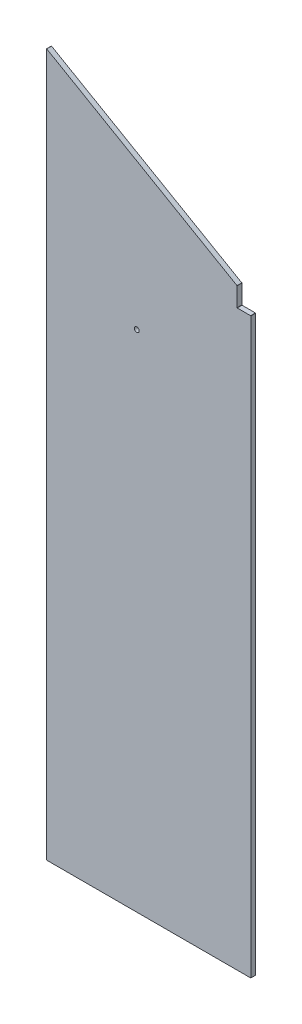
ISO-10303-21;
HEADER;
FILE_DESCRIPTION(('STEP AP214'),'2;1');
FILE_NAME('part.step','',(''),(''),'','','');
FILE_SCHEMA(('AUTOMOTIVE_DESIGN { 1 0 10303 214 1 1 1 1 }'));
ENDSEC;
DATA;
#1=APPLICATION_CONTEXT('core data for automotive mechanical design processes');
#2=APPLICATION_PROTOCOL_DEFINITION('international standard','automotive_design',2000,#1);
#3=PRODUCT_CONTEXT('',#1,'mechanical');
#4=PRODUCT('Part','Part','',(#3));
#5=PRODUCT_RELATED_PRODUCT_CATEGORY('part','',(#4));
#6=PRODUCT_DEFINITION_FORMATION('','',#4);
#7=PRODUCT_DEFINITION_CONTEXT('part definition',#1,'design');
#8=PRODUCT_DEFINITION('design','',#6,#7);
#9=PRODUCT_DEFINITION_SHAPE('','',#8);
#10=(LENGTH_UNIT() NAMED_UNIT(*) SI_UNIT(.MILLI.,.METRE.));
#11=(NAMED_UNIT(*) PLANE_ANGLE_UNIT() SI_UNIT($,.RADIAN.));
#12=(NAMED_UNIT(*) SI_UNIT($,.STERADIAN.) SOLID_ANGLE_UNIT());
#13=UNCERTAINTY_MEASURE_WITH_UNIT(LENGTH_MEASURE(1.E-05),#10,'distance_accuracy_value','');
#14=(GEOMETRIC_REPRESENTATION_CONTEXT(3) GLOBAL_UNCERTAINTY_ASSIGNED_CONTEXT((#13)) GLOBAL_UNIT_ASSIGNED_CONTEXT((#10,
#11,#12)) REPRESENTATION_CONTEXT('',''));
#15=CARTESIAN_POINT('',(0.,0.,0.));
#16=DIRECTION('',(0.,0.,1.));
#17=DIRECTION('',(1.,0.,0.));
#18=AXIS2_PLACEMENT_3D('',#15,#16,#17);
#19=CARTESIAN_POINT('',(270.002,0.,6.35));
#20=DIRECTION('',(0.,1.,0.));
#21=DIRECTION('',(-1.,0.,0.));
#22=AXIS2_PLACEMENT_3D('',#19,#20,#21);
#23=PLANE('',#22);
#24=DIRECTION('',(1.,0.,0.));
#25=VECTOR('',#24,1.);
#26=CARTESIAN_POINT('',(270.002,0.,6.35));
#27=LINE('',#26,#25);
#28=CARTESIAN_POINT('',(0.253999999999976,0.,6.35));
#29=VERTEX_POINT('',#28);
#30=CARTESIAN_POINT('',(270.002,0.,6.35));
#31=VERTEX_POINT('',#30);
#32=EDGE_CURVE('E129',#29,#31,#27,.T.);
#33=ORIENTED_EDGE('',*,*,#32,.F.);
#34=DIRECTION('',(0.,0.,-1.));
#35=VECTOR('',#34,1.);
#36=CARTESIAN_POINT('',(0.253999999999976,0.,6.35));
#37=LINE('',#36,#35);
#38=CARTESIAN_POINT('',(0.253999999999976,0.,0.));
#39=VERTEX_POINT('',#38);
#40=EDGE_CURVE('E218',#29,#39,#37,.T.);
#41=ORIENTED_EDGE('',*,*,#40,.T.);
#42=DIRECTION('',(1.,0.,0.));
#43=VECTOR('',#42,1.);
#44=CARTESIAN_POINT('',(270.002,0.,0.));
#45=LINE('',#44,#43);
#46=CARTESIAN_POINT('',(270.002,0.,0.));
#47=VERTEX_POINT('',#46);
#48=EDGE_CURVE('E155',#39,#47,#45,.T.);
#49=ORIENTED_EDGE('',*,*,#48,.T.);
#50=DIRECTION('',(0.,0.,-1.));
#51=VECTOR('',#50,1.);
#52=CARTESIAN_POINT('',(270.002,0.,6.35));
#53=LINE('',#52,#51);
#54=EDGE_CURVE('E148',#31,#47,#53,.T.);
#55=ORIENTED_EDGE('',*,*,#54,.F.);
#56=EDGE_LOOP('',(#33,#41,#49,#55));
#57=FACE_BOUND('',#56,.T.);
#58=ADVANCED_FACE('F45',(#57),#23,.F.);
#59=CARTESIAN_POINT('',(270.002,0.,6.35));
#60=DIRECTION('',(-1.,0.,0.));
#61=DIRECTION('',(0.,-1.,0.));
#62=AXIS2_PLACEMENT_3D('',#59,#60,#61);
#63=PLANE('',#62);
#64=DIRECTION('',(0.,1.,0.));
#65=VECTOR('',#64,1.);
#66=CARTESIAN_POINT('',(270.002,0.,0.));
#67=LINE('',#66,#65);
#68=CARTESIAN_POINT('',(270.002,757.639717478425,0.));
#69=VERTEX_POINT('',#68);
#70=EDGE_CURVE('E240',#47,#69,#67,.T.);
#71=ORIENTED_EDGE('',*,*,#70,.T.);
#72=DIRECTION('',(0.,0.,-1.));
#73=VECTOR('',#72,1.);
#74=CARTESIAN_POINT('',(270.002,757.639717478425,6.35));
#75=LINE('',#74,#73);
#76=CARTESIAN_POINT('',(270.002,757.639717478425,6.35));
#77=VERTEX_POINT('',#76);
#78=EDGE_CURVE('E150',#69,#77,#75,.F.);
#79=ORIENTED_EDGE('',*,*,#78,.T.);
#80=DIRECTION('',(0.,1.,0.));
#81=VECTOR('',#80,1.);
#82=CARTESIAN_POINT('',(270.002,0.,6.35));
#83=LINE('',#82,#81);
#84=EDGE_CURVE('E133',#31,#77,#83,.T.);
#85=ORIENTED_EDGE('',*,*,#84,.F.);
#86=ORIENTED_EDGE('',*,*,#54,.T.);
#87=EDGE_LOOP('',(#71,#79,#85,#86));
#88=FACE_BOUND('',#87,.T.);
#89=ADVANCED_FACE('F147',(#88),#63,.F.);
#90=CARTESIAN_POINT('',(251.956545955641,757.893717478425,6.35));
#91=DIRECTION('',(0.,-1.,0.));
#92=DIRECTION('',(1.,0.,0.));
#93=AXIS2_PLACEMENT_3D('',#90,#91,#92);
#94=PLANE('',#93);
#95=DIRECTION('',(-1.,0.,0.));
#96=VECTOR('',#95,1.);
#97=CARTESIAN_POINT('',(251.956545955641,757.893717478425,0.));
#98=LINE('',#97,#96);
#99=CARTESIAN_POINT('',(269.748,757.893717478425,0.));
#100=VERTEX_POINT('',#99);
#101=CARTESIAN_POINT('',(252.210545955641,757.893717478425,0.));
#102=VERTEX_POINT('',#101);
#103=EDGE_CURVE('E228',#100,#102,#98,.T.);
#104=ORIENTED_EDGE('',*,*,#103,.T.);
#105=DIRECTION('',(0.,0.,-1.));
#106=VECTOR('',#105,1.);
#107=CARTESIAN_POINT('',(252.210545955641,757.893717478425,6.35));
#108=LINE('',#107,#106);
#109=CARTESIAN_POINT('',(252.210545955641,757.893717478425,6.35));
#110=VERTEX_POINT('',#109);
#111=EDGE_CURVE('E178',#102,#110,#108,.F.);
#112=ORIENTED_EDGE('',*,*,#111,.T.);
#113=DIRECTION('',(-1.,0.,0.));
#114=VECTOR('',#113,1.);
#115=CARTESIAN_POINT('',(251.956545955641,757.893717478425,6.35));
#116=LINE('',#115,#114);
#117=CARTESIAN_POINT('',(269.748,757.893717478425,6.35));
#118=VERTEX_POINT('',#117);
#119=EDGE_CURVE('E152',#118,#110,#116,.T.);
#120=ORIENTED_EDGE('',*,*,#119,.F.);
#121=DIRECTION('',(0.,0.,-1.));
#122=VECTOR('',#121,1.);
#123=CARTESIAN_POINT('',(269.748,757.893717478425,6.35));
#124=LINE('',#123,#122);
#125=EDGE_CURVE('E174',#118,#100,#124,.T.);
#126=ORIENTED_EDGE('',*,*,#125,.T.);
#127=EDGE_LOOP('',(#104,#112,#120,#126));
#128=FACE_BOUND('',#127,.T.);
#129=ADVANCED_FACE('F235',(#128),#94,.F.);
#130=CARTESIAN_POINT('',(251.956545955641,783.293717478425,6.35));
#131=DIRECTION('',(-1.,0.,0.));
#132=DIRECTION('',(0.,0.,1.));
#133=AXIS2_PLACEMENT_3D('',#130,#131,#132);
#134=PLANE('',#133);
#135=DIRECTION('',(0.,1.,0.));
#136=VECTOR('',#135,1.);
#137=CARTESIAN_POINT('',(251.956545955641,783.293717478425,6.35));
#138=LINE('',#137,#136);
#139=CARTESIAN_POINT('',(251.956545955641,758.147717478425,6.35));
#140=VERTEX_POINT('',#139);
#141=CARTESIAN_POINT('',(251.956545955641,783.14707051005,6.35));
#142=VERTEX_POINT('',#141);
#143=EDGE_CURVE('E245',#140,#142,#138,.T.);
#144=ORIENTED_EDGE('',*,*,#143,.F.);
#145=DIRECTION('',(0.,0.,-1.));
#146=VECTOR('',#145,1.);
#147=CARTESIAN_POINT('',(251.956545955641,758.147717478425,0.));
#148=LINE('',#147,#146);
#149=CARTESIAN_POINT('',(251.956545955641,758.147717478425,0.));
#150=VERTEX_POINT('',#149);
#151=EDGE_CURVE('E164',#140,#150,#148,.T.);
#152=ORIENTED_EDGE('',*,*,#151,.T.);
#153=DIRECTION('',(0.,1.,0.));
#154=VECTOR('',#153,1.);
#155=CARTESIAN_POINT('',(251.956545955641,783.293717478425,0.));
#156=LINE('',#155,#154);
#157=CARTESIAN_POINT('',(251.956545955641,783.14707051005,0.));
#158=VERTEX_POINT('',#157);
#159=EDGE_CURVE('E230',#150,#158,#156,.T.);
#160=ORIENTED_EDGE('',*,*,#159,.T.);
#161=DIRECTION('',(0.,0.,-1.));
#162=VECTOR('',#161,1.);
#163=CARTESIAN_POINT('',(251.956545955641,783.14707051005,6.35));
#164=LINE('',#163,#162);
#165=EDGE_CURVE('E158',#158,#142,#164,.F.);
#166=ORIENTED_EDGE('',*,*,#165,.T.);
#167=EDGE_LOOP('',(#144,#152,#160,#166));
#168=FACE_BOUND('',#167,.T.);
#169=ADVANCED_FACE('F248',(#168),#134,.F.);
#170=CARTESIAN_POINT('',(0.,928.76089711,6.35));
#171=DIRECTION('',(-0.499999999999995,-0.866025403784442,0.));
#172=DIRECTION('',(0.866025403784442,-0.499999999999995,0.));
#173=AXIS2_PLACEMENT_3D('',#170,#171,#172);
#174=PLANE('',#173);
#175=DIRECTION('',(-0.866025403784442,0.499999999999995,0.));
#176=VECTOR('',#175,1.);
#177=CARTESIAN_POINT('',(0.,928.76089711,6.35));
#178=LINE('',#177,#176);
#179=CARTESIAN_POINT('',(251.829545955641,783.367040962612,6.35));
#180=VERTEX_POINT('',#179);
#181=CARTESIAN_POINT('',(0.381000000000043,928.540926657439,6.35));
#182=VERTEX_POINT('',#181);
#183=EDGE_CURVE('E166',#180,#182,#178,.T.);
#184=ORIENTED_EDGE('',*,*,#183,.F.);
#185=DIRECTION('',(0.,0.,-1.));
#186=VECTOR('',#185,1.);
#187=CARTESIAN_POINT('',(251.829545955641,783.367040962612,6.35));
#188=LINE('',#187,#186);
#189=CARTESIAN_POINT('',(251.829545955641,783.367040962612,0.));
#190=VERTEX_POINT('',#189);
#191=EDGE_CURVE('E184',#180,#190,#188,.T.);
#192=ORIENTED_EDGE('',*,*,#191,.T.);
#193=DIRECTION('',(-0.866025403784442,0.499999999999995,0.));
#194=VECTOR('',#193,1.);
#195=CARTESIAN_POINT('',(0.,928.76089711,0.));
#196=LINE('',#195,#194);
#197=CARTESIAN_POINT('',(0.381000000000043,928.540926657439,0.));
#198=VERTEX_POINT('',#197);
#199=EDGE_CURVE('E264',#190,#198,#196,.T.);
#200=ORIENTED_EDGE('',*,*,#199,.T.);
#201=DIRECTION('',(0.,0.,-1.));
#202=VECTOR('',#201,1.);
#203=CARTESIAN_POINT('',(0.381000000000037,928.540926657439,6.35));
#204=LINE('',#203,#202);
#205=EDGE_CURVE('E181',#198,#182,#204,.F.);
#206=ORIENTED_EDGE('',*,*,#205,.T.);
#207=EDGE_LOOP('',(#184,#192,#200,#206));
#208=FACE_BOUND('',#207,.T.);
#209=ADVANCED_FACE('F304',(#208),#174,.F.);
#210=CARTESIAN_POINT('',(0.,0.,6.35));
#211=DIRECTION('',(1.,0.,0.));
#212=DIRECTION('',(0.,0.,-1.));
#213=AXIS2_PLACEMENT_3D('',#210,#211,#212);
#214=PLANE('',#213);
#215=DIRECTION('',(0.,-1.,0.));
#216=VECTOR('',#215,1.);
#217=CARTESIAN_POINT('',(0.,0.,6.35));
#218=LINE('',#217,#216);
#219=CARTESIAN_POINT('',(0.,928.320956204877,6.35));
#220=VERTEX_POINT('',#219);
#221=CARTESIAN_POINT('',(0.,0.254,6.35));
#222=VERTEX_POINT('',#221);
#223=EDGE_CURVE('E159',#220,#222,#218,.T.);
#224=ORIENTED_EDGE('',*,*,#223,.F.);
#225=DIRECTION('',(0.,0.,-1.));
#226=VECTOR('',#225,1.);
#227=CARTESIAN_POINT('',(0.,928.320956204877,6.35));
#228=LINE('',#227,#226);
#229=CARTESIAN_POINT('',(0.,928.320956204877,0.));
#230=VERTEX_POINT('',#229);
#231=EDGE_CURVE('E212',#220,#230,#228,.T.);
#232=ORIENTED_EDGE('',*,*,#231,.T.);
#233=DIRECTION('',(0.,-1.,0.));
#234=VECTOR('',#233,1.);
#235=CARTESIAN_POINT('',(0.,0.,0.));
#236=LINE('',#235,#234);
#237=CARTESIAN_POINT('',(0.,0.254,0.));
#238=VERTEX_POINT('',#237);
#239=EDGE_CURVE('E142',#230,#238,#236,.T.);
#240=ORIENTED_EDGE('',*,*,#239,.T.);
#241=DIRECTION('',(0.,0.,-1.));
#242=VECTOR('',#241,1.);
#243=CARTESIAN_POINT('',(0.,0.254,6.35));
#244=LINE('',#243,#242);
#245=EDGE_CURVE('E61',#238,#222,#244,.F.);
#246=ORIENTED_EDGE('',*,*,#245,.T.);
#247=EDGE_LOOP('',(#224,#232,#240,#246));
#248=FACE_BOUND('',#247,.T.);
#249=ADVANCED_FACE('F273',(#248),#214,.F.);
#250=CARTESIAN_POINT('',(0.,0.,6.35));
#251=DIRECTION('',(0.,0.,-1.));
#252=DIRECTION('',(-1.,0.,0.));
#253=AXIS2_PLACEMENT_3D('',#250,#251,#252);
#254=PLANE('',#253);
#255=CARTESIAN_POINT('',(119.38,666.75,6.35));
#256=DIRECTION('',(0.,0.,1.));
#257=DIRECTION('',(1.,0.,0.));
#258=AXIS2_PLACEMENT_3D('',#255,#256,#257);
#259=CIRCLE('',#258,3.175);
#260=CARTESIAN_POINT('',(122.555,666.75,6.35));
#261=VERTEX_POINT('',#260);
#262=EDGE_CURVE('E408',#261,#261,#259,.T.);
#263=ORIENTED_EDGE('',*,*,#262,.F.);
#264=EDGE_LOOP('',(#263));
#265=FACE_BOUND('',#264,.T.);
#266=ORIENTED_EDGE('',*,*,#143,.T.);
#267=CARTESIAN_POINT('',(251.702545955641,783.14707051005,6.35));
#268=DIRECTION('',(0.,0.,-1.));
#269=DIRECTION('',(-1.,0.,0.));
#270=AXIS2_PLACEMENT_3D('',#267,#268,#269);
#271=CIRCLE('',#270,0.254);
#272=EDGE_CURVE('E207',#142,#180,#271,.F.);
#273=ORIENTED_EDGE('',*,*,#272,.T.);
#274=ORIENTED_EDGE('',*,*,#183,.T.);
#275=CARTESIAN_POINT('',(0.254,928.320956204877,6.35));
#276=DIRECTION('',(0.,0.,-1.));
#277=DIRECTION('',(-1.,0.,0.));
#278=AXIS2_PLACEMENT_3D('',#275,#276,#277);
#279=CIRCLE('',#278,0.254);
#280=EDGE_CURVE('E68',#182,#220,#279,.F.);
#281=ORIENTED_EDGE('',*,*,#280,.T.);
#282=ORIENTED_EDGE('',*,*,#223,.T.);
#283=CARTESIAN_POINT('',(0.253999999999976,0.254,6.35));
#284=DIRECTION('',(0.,0.,-1.));
#285=DIRECTION('',(-1.,0.,0.));
#286=AXIS2_PLACEMENT_3D('',#283,#284,#285);
#287=CIRCLE('',#286,0.254);
#288=EDGE_CURVE('E136',#222,#29,#287,.F.);
#289=ORIENTED_EDGE('',*,*,#288,.T.);
#290=ORIENTED_EDGE('',*,*,#32,.T.);
#291=ORIENTED_EDGE('',*,*,#84,.T.);
#292=CARTESIAN_POINT('',(269.748,757.639717478425,6.35));
#293=DIRECTION('',(0.,0.,-1.));
#294=DIRECTION('',(-1.,0.,0.));
#295=AXIS2_PLACEMENT_3D('',#292,#293,#294);
#296=CIRCLE('',#295,0.254);
#297=EDGE_CURVE('E202',#77,#118,#296,.F.);
#298=ORIENTED_EDGE('',*,*,#297,.T.);
#299=ORIENTED_EDGE('',*,*,#119,.T.);
#300=CARTESIAN_POINT('',(252.210545955641,758.147717478425,6.35));
#301=DIRECTION('',(0.,0.,-1.));
#302=DIRECTION('',(-1.,0.,0.));
#303=AXIS2_PLACEMENT_3D('',#300,#301,#302);
#304=CIRCLE('',#303,0.254);
#305=EDGE_CURVE('E11',#110,#140,#304,.T.);
#306=ORIENTED_EDGE('',*,*,#305,.T.);
#307=EDGE_LOOP('',(#266,#273,#274,#281,#282,#289,#290,#291,#298,#299,#306));
#308=FACE_BOUND('',#307,.T.);
#309=ADVANCED_FACE('F132',(#265,#308),#254,.F.);
#310=CARTESIAN_POINT('',(0.,0.,0.));
#311=DIRECTION('',(0.,0.,-1.));
#312=DIRECTION('',(-1.,0.,0.));
#313=AXIS2_PLACEMENT_3D('',#310,#311,#312);
#314=PLANE('',#313);
#315=CARTESIAN_POINT('',(119.38,666.75,0.));
#316=DIRECTION('',(0.,0.,1.));
#317=DIRECTION('',(1.,0.,0.));
#318=AXIS2_PLACEMENT_3D('',#315,#316,#317);
#319=CIRCLE('',#318,3.175);
#320=CARTESIAN_POINT('',(122.555,666.75,0.));
#321=VERTEX_POINT('',#320);
#322=EDGE_CURVE('E260',#321,#321,#319,.T.);
#323=ORIENTED_EDGE('',*,*,#322,.T.);
#324=EDGE_LOOP('',(#323));
#325=FACE_BOUND('',#324,.T.);
#326=ORIENTED_EDGE('',*,*,#199,.F.);
#327=CARTESIAN_POINT('',(251.702545955641,783.14707051005,0.));
#328=DIRECTION('',(0.,0.,-1.));
#329=DIRECTION('',(-1.,0.,0.));
#330=AXIS2_PLACEMENT_3D('',#327,#328,#329);
#331=CIRCLE('',#330,0.254);
#332=EDGE_CURVE('E197',#190,#158,#331,.T.);
#333=ORIENTED_EDGE('',*,*,#332,.T.);
#334=ORIENTED_EDGE('',*,*,#159,.F.);
#335=CARTESIAN_POINT('',(252.210545955641,758.147717478425,0.));
#336=DIRECTION('',(0.,0.,-1.));
#337=DIRECTION('',(-1.,0.,0.));
#338=AXIS2_PLACEMENT_3D('',#335,#336,#337);
#339=CIRCLE('',#338,0.254);
#340=EDGE_CURVE('E54',#150,#102,#339,.F.);
#341=ORIENTED_EDGE('',*,*,#340,.T.);
#342=ORIENTED_EDGE('',*,*,#103,.F.);
#343=CARTESIAN_POINT('',(269.748,757.639717478425,0.));
#344=DIRECTION('',(0.,0.,-1.));
#345=DIRECTION('',(-1.,0.,0.));
#346=AXIS2_PLACEMENT_3D('',#343,#344,#345);
#347=CIRCLE('',#346,0.254);
#348=EDGE_CURVE('E191',#100,#69,#347,.T.);
#349=ORIENTED_EDGE('',*,*,#348,.T.);
#350=ORIENTED_EDGE('',*,*,#70,.F.);
#351=ORIENTED_EDGE('',*,*,#48,.F.);
#352=CARTESIAN_POINT('',(0.253999999999976,0.254,0.));
#353=DIRECTION('',(0.,0.,-1.));
#354=DIRECTION('',(-1.,0.,0.));
#355=AXIS2_PLACEMENT_3D('',#352,#353,#354);
#356=CIRCLE('',#355,0.254);
#357=EDGE_CURVE('E188',#39,#238,#356,.T.);
#358=ORIENTED_EDGE('',*,*,#357,.T.);
#359=ORIENTED_EDGE('',*,*,#239,.F.);
#360=CARTESIAN_POINT('',(0.254,928.320956204877,0.));
#361=DIRECTION('',(0.,0.,-1.));
#362=DIRECTION('',(-1.,0.,0.));
#363=AXIS2_PLACEMENT_3D('',#360,#361,#362);
#364=CIRCLE('',#363,0.254);
#365=EDGE_CURVE('E194',#230,#198,#364,.T.);
#366=ORIENTED_EDGE('',*,*,#365,.T.);
#367=EDGE_LOOP('',(#326,#333,#334,#341,#342,#349,#350,#351,#358,#359,#366));
#368=FACE_BOUND('',#367,.T.);
#369=ADVANCED_FACE('F227',(#325,#368),#314,.T.);
#370=CARTESIAN_POINT('',(252.210545955641,758.147717478425,6.35));
#371=DIRECTION('',(0.,0.,1.));
#372=DIRECTION('',(1.,0.,0.));
#373=AXIS2_PLACEMENT_3D('',#370,#371,#372);
#374=CYLINDRICAL_SURFACE('',#373,0.254);
#375=ORIENTED_EDGE('',*,*,#305,.F.);
#376=ORIENTED_EDGE('',*,*,#111,.F.);
#377=ORIENTED_EDGE('',*,*,#340,.F.);
#378=ORIENTED_EDGE('',*,*,#151,.F.);
#379=EDGE_LOOP('',(#375,#376,#377,#378));
#380=FACE_BOUND('',#379,.T.);
#381=ADVANCED_FACE('F243',(#380),#374,.F.);
#382=CARTESIAN_POINT('',(251.702545955641,783.14707051005,6.35));
#383=DIRECTION('',(0.,0.,-1.));
#384=DIRECTION('',(-1.,0.,0.));
#385=AXIS2_PLACEMENT_3D('',#382,#383,#384);
#386=CYLINDRICAL_SURFACE('',#385,0.254);
#387=ORIENTED_EDGE('',*,*,#272,.F.);
#388=ORIENTED_EDGE('',*,*,#165,.F.);
#389=ORIENTED_EDGE('',*,*,#332,.F.);
#390=ORIENTED_EDGE('',*,*,#191,.F.);
#391=EDGE_LOOP('',(#387,#388,#389,#390));
#392=FACE_BOUND('',#391,.T.);
#393=ADVANCED_FACE('F285',(#392),#386,.T.);
#394=CARTESIAN_POINT('',(0.254,928.320956204877,6.35));
#395=DIRECTION('',(0.,0.,-1.));
#396=DIRECTION('',(-1.,0.,0.));
#397=AXIS2_PLACEMENT_3D('',#394,#395,#396);
#398=CYLINDRICAL_SURFACE('',#397,0.254);
#399=ORIENTED_EDGE('',*,*,#280,.F.);
#400=ORIENTED_EDGE('',*,*,#205,.F.);
#401=ORIENTED_EDGE('',*,*,#365,.F.);
#402=ORIENTED_EDGE('',*,*,#231,.F.);
#403=EDGE_LOOP('',(#399,#400,#401,#402));
#404=FACE_BOUND('',#403,.T.);
#405=ADVANCED_FACE('F279',(#404),#398,.T.);
#406=CARTESIAN_POINT('',(269.748,757.639717478425,6.35));
#407=DIRECTION('',(0.,0.,-1.));
#408=DIRECTION('',(-1.,0.,0.));
#409=AXIS2_PLACEMENT_3D('',#406,#407,#408);
#410=CYLINDRICAL_SURFACE('',#409,0.254);
#411=ORIENTED_EDGE('',*,*,#297,.F.);
#412=ORIENTED_EDGE('',*,*,#78,.F.);
#413=ORIENTED_EDGE('',*,*,#348,.F.);
#414=ORIENTED_EDGE('',*,*,#125,.F.);
#415=EDGE_LOOP('',(#411,#412,#413,#414));
#416=FACE_BOUND('',#415,.T.);
#417=ADVANCED_FACE('F277',(#416),#410,.T.);
#418=CARTESIAN_POINT('',(0.253999999999976,0.254,6.35));
#419=DIRECTION('',(0.,0.,-1.));
#420=DIRECTION('',(-1.,0.,0.));
#421=AXIS2_PLACEMENT_3D('',#418,#419,#420);
#422=CYLINDRICAL_SURFACE('',#421,0.254);
#423=ORIENTED_EDGE('',*,*,#288,.F.);
#424=ORIENTED_EDGE('',*,*,#245,.F.);
#425=ORIENTED_EDGE('',*,*,#357,.F.);
#426=ORIENTED_EDGE('',*,*,#40,.F.);
#427=EDGE_LOOP('',(#423,#424,#425,#426));
#428=FACE_BOUND('',#427,.T.);
#429=ADVANCED_FACE('F47',(#428),#422,.T.);
#430=CARTESIAN_POINT('',(119.38,666.75,0.));
#431=DIRECTION('',(0.,0.,1.));
#432=DIRECTION('',(1.,0.,0.));
#433=AXIS2_PLACEMENT_3D('',#430,#431,#432);
#434=CYLINDRICAL_SURFACE('',#433,3.175);
#435=ORIENTED_EDGE('',*,*,#322,.F.);
#436=EDGE_LOOP('',(#435));
#437=FACE_BOUND('',#436,.T.);
#438=ORIENTED_EDGE('',*,*,#262,.T.);
#439=EDGE_LOOP('',(#438));
#440=FACE_BOUND('',#439,.T.);
#441=ADVANCED_FACE('F284',(#437,#440),#434,.F.);
#442=CLOSED_SHELL('',(#58,#89,#129,#169,#209,#249,#309,#369,#381,#393,#405,#417,#429,#441));
#443=MANIFOLD_SOLID_BREP('B2',#442);
#444=ADVANCED_BREP_SHAPE_REPRESENTATION('',(#18,#443),#14);
#445=SHAPE_DEFINITION_REPRESENTATION(#9,#444);
ENDSEC;
END-ISO-10303-21;
